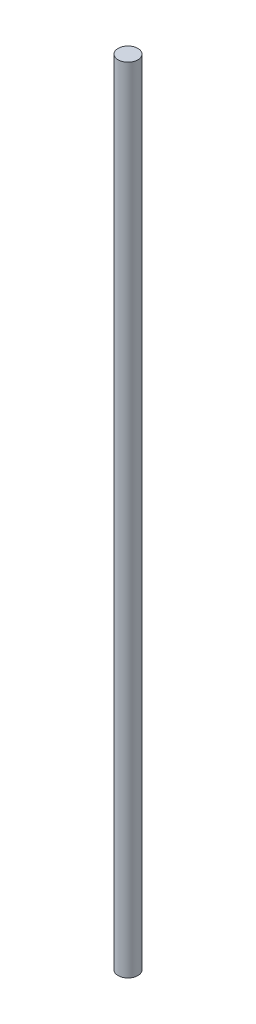
ISO-10303-21;
HEADER;
FILE_DESCRIPTION(('STEP AP214'),'2;1');
FILE_NAME('part.step','',(''),(''),'','','');
FILE_SCHEMA(('AUTOMOTIVE_DESIGN { 1 0 10303 214 1 1 1 1 }'));
ENDSEC;
DATA;
#1=APPLICATION_CONTEXT('core data for automotive mechanical design processes');
#2=APPLICATION_PROTOCOL_DEFINITION('international standard','automotive_design',2000,#1);
#3=PRODUCT_CONTEXT('',#1,'mechanical');
#4=PRODUCT('Part','Part','',(#3));
#5=PRODUCT_RELATED_PRODUCT_CATEGORY('part','',(#4));
#6=PRODUCT_DEFINITION_FORMATION('','',#4);
#7=PRODUCT_DEFINITION_CONTEXT('part definition',#1,'design');
#8=PRODUCT_DEFINITION('design','',#6,#7);
#9=PRODUCT_DEFINITION_SHAPE('','',#8);
#10=(LENGTH_UNIT() NAMED_UNIT(*) SI_UNIT(.MILLI.,.METRE.));
#11=(NAMED_UNIT(*) PLANE_ANGLE_UNIT() SI_UNIT($,.RADIAN.));
#12=(NAMED_UNIT(*) SI_UNIT($,.STERADIAN.) SOLID_ANGLE_UNIT());
#13=UNCERTAINTY_MEASURE_WITH_UNIT(LENGTH_MEASURE(1.E-05),#10,'distance_accuracy_value','');
#14=(GEOMETRIC_REPRESENTATION_CONTEXT(3) GLOBAL_UNCERTAINTY_ASSIGNED_CONTEXT((#13)) GLOBAL_UNIT_ASSIGNED_CONTEXT((#10,
#11,#12)) REPRESENTATION_CONTEXT('',''));
#15=CARTESIAN_POINT('',(0.,0.,0.));
#16=DIRECTION('',(0.,0.,1.));
#17=DIRECTION('',(1.,0.,0.));
#18=AXIS2_PLACEMENT_3D('',#15,#16,#17);
#19=CARTESIAN_POINT('',(0.,160.,0.));
#20=DIRECTION('',(0.,-1.,0.));
#21=DIRECTION('',(0.,0.,-1.));
#22=AXIS2_PLACEMENT_3D('',#19,#20,#21);
#23=CYLINDRICAL_SURFACE('',#22,2.);
#24=CARTESIAN_POINT('',(0.,160.,0.));
#25=DIRECTION('',(0.,1.,0.));
#26=DIRECTION('',(0.,0.,1.));
#27=AXIS2_PLACEMENT_3D('',#24,#25,#26);
#28=CIRCLE('',#27,2.);
#29=CARTESIAN_POINT('',(0.,160.,2.));
#30=VERTEX_POINT('',#29);
#31=EDGE_CURVE('E10',#30,#30,#28,.T.);
#32=ORIENTED_EDGE('',*,*,#31,.F.);
#33=EDGE_LOOP('',(#32));
#34=FACE_BOUND('',#33,.T.);
#35=CARTESIAN_POINT('',(0.,0.,0.));
#36=DIRECTION('',(0.,1.,0.));
#37=DIRECTION('',(0.,0.,1.));
#38=AXIS2_PLACEMENT_3D('',#35,#36,#37);
#39=CIRCLE('',#38,2.);
#40=CARTESIAN_POINT('',(0.,0.,2.));
#41=VERTEX_POINT('',#40);
#42=EDGE_CURVE('E44',#41,#41,#39,.T.);
#43=ORIENTED_EDGE('',*,*,#42,.T.);
#44=EDGE_LOOP('',(#43));
#45=FACE_BOUND('',#44,.T.);
#46=ADVANCED_FACE('F41',(#34,#45),#23,.T.);
#47=CARTESIAN_POINT('',(0.,160.,0.));
#48=DIRECTION('',(0.,1.,0.));
#49=DIRECTION('',(0.,0.,1.));
#50=AXIS2_PLACEMENT_3D('',#47,#48,#49);
#51=PLANE('',#50);
#52=ORIENTED_EDGE('',*,*,#31,.T.);
#53=EDGE_LOOP('',(#52));
#54=FACE_BOUND('',#53,.T.);
#55=ADVANCED_FACE('F58',(#54),#51,.T.);
#56=CARTESIAN_POINT('',(0.,0.,0.));
#57=DIRECTION('',(0.,1.,0.));
#58=DIRECTION('',(0.,0.,1.));
#59=AXIS2_PLACEMENT_3D('',#56,#57,#58);
#60=PLANE('',#59);
#61=ORIENTED_EDGE('',*,*,#42,.F.);
#62=EDGE_LOOP('',(#61));
#63=FACE_BOUND('',#62,.T.);
#64=ADVANCED_FACE('F56',(#63),#60,.F.);
#65=CLOSED_SHELL('',(#46,#55,#64));
#66=MANIFOLD_SOLID_BREP('B2',#65);
#67=ADVANCED_BREP_SHAPE_REPRESENTATION('',(#18,#66),#14);
#68=SHAPE_DEFINITION_REPRESENTATION(#9,#67);
ENDSEC;
END-ISO-10303-21;
